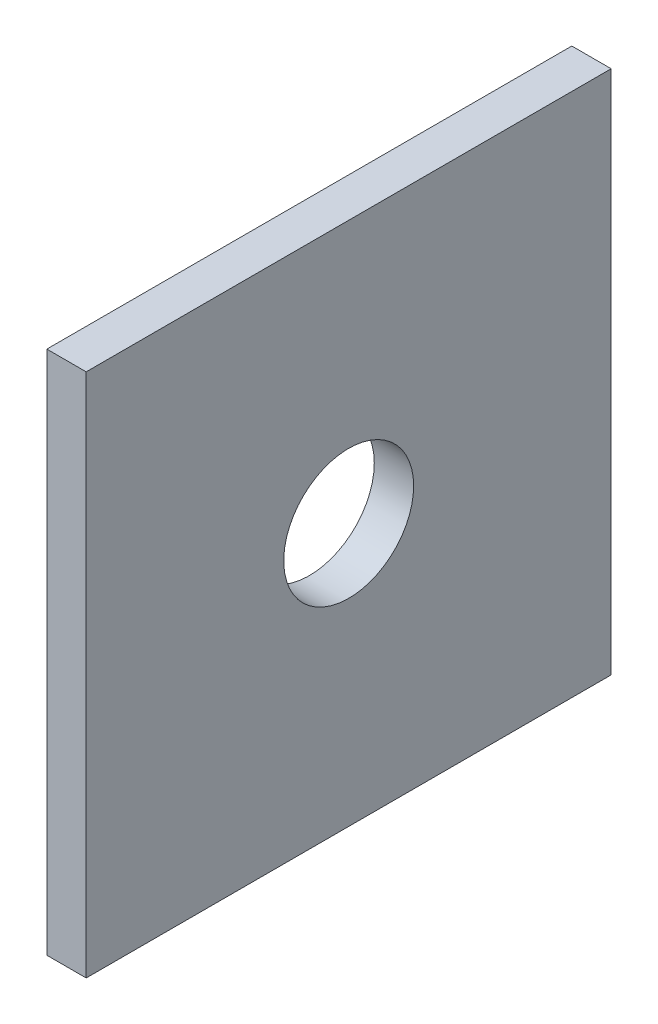
ISO-10303-21;
HEADER;
FILE_DESCRIPTION(('STEP AP214'),'2;1');
FILE_NAME('part.step','',(''),(''),'','','');
FILE_SCHEMA(('AUTOMOTIVE_DESIGN { 1 0 10303 214 1 1 1 1 }'));
ENDSEC;
DATA;
#1=APPLICATION_CONTEXT('core data for automotive mechanical design processes');
#2=APPLICATION_PROTOCOL_DEFINITION('international standard','automotive_design',2000,#1);
#3=PRODUCT_CONTEXT('',#1,'mechanical');
#4=PRODUCT('Part','Part','',(#3));
#5=PRODUCT_RELATED_PRODUCT_CATEGORY('part','',(#4));
#6=PRODUCT_DEFINITION_FORMATION('','',#4);
#7=PRODUCT_DEFINITION_CONTEXT('part definition',#1,'design');
#8=PRODUCT_DEFINITION('design','',#6,#7);
#9=PRODUCT_DEFINITION_SHAPE('','',#8);
#10=(LENGTH_UNIT() NAMED_UNIT(*) SI_UNIT(.MILLI.,.METRE.));
#11=(NAMED_UNIT(*) PLANE_ANGLE_UNIT() SI_UNIT($,.RADIAN.));
#12=(NAMED_UNIT(*) SI_UNIT($,.STERADIAN.) SOLID_ANGLE_UNIT());
#13=UNCERTAINTY_MEASURE_WITH_UNIT(LENGTH_MEASURE(1.E-05),#10,'distance_accuracy_value','');
#14=(GEOMETRIC_REPRESENTATION_CONTEXT(3) GLOBAL_UNCERTAINTY_ASSIGNED_CONTEXT((#13)) GLOBAL_UNIT_ASSIGNED_CONTEXT((#10,
#11,#12)) REPRESENTATION_CONTEXT('',''));
#15=CARTESIAN_POINT('',(0.,0.,0.));
#16=DIRECTION('',(0.,0.,1.));
#17=DIRECTION('',(1.,0.,0.));
#18=AXIS2_PLACEMENT_3D('',#15,#16,#17);
#19=CARTESIAN_POINT('',(3.,20.,-20.));
#20=DIRECTION('',(0.,0.,1.));
#21=DIRECTION('',(0.,-1.,0.));
#22=AXIS2_PLACEMENT_3D('',#19,#20,#21);
#23=PLANE('',#22);
#24=DIRECTION('',(0.,1.,0.));
#25=VECTOR('',#24,1.);
#26=CARTESIAN_POINT('',(0.,20.,-20.));
#27=LINE('',#26,#25);
#28=CARTESIAN_POINT('',(0.,-20.,-20.));
#29=VERTEX_POINT('',#28);
#30=CARTESIAN_POINT('',(0.,20.,-20.));
#31=VERTEX_POINT('',#30);
#32=EDGE_CURVE('E107',#29,#31,#27,.T.);
#33=ORIENTED_EDGE('',*,*,#32,.T.);
#34=DIRECTION('',(-1.,0.,0.));
#35=VECTOR('',#34,1.);
#36=CARTESIAN_POINT('',(3.,20.,-20.));
#37=LINE('',#36,#35);
#38=CARTESIAN_POINT('',(3.,20.,-20.));
#39=VERTEX_POINT('',#38);
#40=EDGE_CURVE('E11',#39,#31,#37,.T.);
#41=ORIENTED_EDGE('',*,*,#40,.F.);
#42=DIRECTION('',(0.,1.,0.));
#43=VECTOR('',#42,1.);
#44=CARTESIAN_POINT('',(3.,20.,-20.));
#45=LINE('',#44,#43);
#46=CARTESIAN_POINT('',(3.,-20.,-20.));
#47=VERTEX_POINT('',#46);
#48=EDGE_CURVE('E91',#47,#39,#45,.T.);
#49=ORIENTED_EDGE('',*,*,#48,.F.);
#50=DIRECTION('',(-1.,0.,0.));
#51=VECTOR('',#50,1.);
#52=CARTESIAN_POINT('',(3.,-20.,-20.));
#53=LINE('',#52,#51);
#54=EDGE_CURVE('E103',#47,#29,#53,.T.);
#55=ORIENTED_EDGE('',*,*,#54,.T.);
#56=EDGE_LOOP('',(#33,#41,#49,#55));
#57=FACE_BOUND('',#56,.T.);
#58=ADVANCED_FACE('F39',(#57),#23,.F.);
#59=CARTESIAN_POINT('',(3.,20.,20.));
#60=DIRECTION('',(0.,-1.,0.));
#61=DIRECTION('',(0.,0.,-1.));
#62=AXIS2_PLACEMENT_3D('',#59,#60,#61);
#63=PLANE('',#62);
#64=DIRECTION('',(0.,0.,1.));
#65=VECTOR('',#64,1.);
#66=CARTESIAN_POINT('',(0.,20.,20.));
#67=LINE('',#66,#65);
#68=CARTESIAN_POINT('',(0.,20.,20.));
#69=VERTEX_POINT('',#68);
#70=EDGE_CURVE('E96',#31,#69,#67,.T.);
#71=ORIENTED_EDGE('',*,*,#70,.T.);
#72=DIRECTION('',(-1.,0.,0.));
#73=VECTOR('',#72,1.);
#74=CARTESIAN_POINT('',(3.,20.,20.));
#75=LINE('',#74,#73);
#76=CARTESIAN_POINT('',(3.,20.,20.));
#77=VERTEX_POINT('',#76);
#78=EDGE_CURVE('E48',#77,#69,#75,.T.);
#79=ORIENTED_EDGE('',*,*,#78,.F.);
#80=DIRECTION('',(0.,0.,1.));
#81=VECTOR('',#80,1.);
#82=CARTESIAN_POINT('',(3.,20.,20.));
#83=LINE('',#82,#81);
#84=EDGE_CURVE('E86',#39,#77,#83,.T.);
#85=ORIENTED_EDGE('',*,*,#84,.F.);
#86=ORIENTED_EDGE('',*,*,#40,.T.);
#87=EDGE_LOOP('',(#71,#79,#85,#86));
#88=FACE_BOUND('',#87,.T.);
#89=ADVANCED_FACE('F95',(#88),#63,.F.);
#90=CARTESIAN_POINT('',(3.,20.,20.));
#91=DIRECTION('',(0.,0.,-1.));
#92=DIRECTION('',(0.,1.,0.));
#93=AXIS2_PLACEMENT_3D('',#90,#91,#92);
#94=PLANE('',#93);
#95=DIRECTION('',(0.,-1.,0.));
#96=VECTOR('',#95,1.);
#97=CARTESIAN_POINT('',(0.,20.,20.));
#98=LINE('',#97,#96);
#99=CARTESIAN_POINT('',(0.,-20.,20.));
#100=VERTEX_POINT('',#99);
#101=EDGE_CURVE('E73',#69,#100,#98,.T.);
#102=ORIENTED_EDGE('',*,*,#101,.T.);
#103=DIRECTION('',(-1.,0.,0.));
#104=VECTOR('',#103,1.);
#105=CARTESIAN_POINT('',(3.,-20.,20.));
#106=LINE('',#105,#104);
#107=CARTESIAN_POINT('',(3.,-20.,20.));
#108=VERTEX_POINT('',#107);
#109=EDGE_CURVE('E98',#108,#100,#106,.T.);
#110=ORIENTED_EDGE('',*,*,#109,.F.);
#111=DIRECTION('',(0.,-1.,0.));
#112=VECTOR('',#111,1.);
#113=CARTESIAN_POINT('',(3.,20.,20.));
#114=LINE('',#113,#112);
#115=EDGE_CURVE('E89',#77,#108,#114,.T.);
#116=ORIENTED_EDGE('',*,*,#115,.F.);
#117=ORIENTED_EDGE('',*,*,#78,.T.);
#118=EDGE_LOOP('',(#102,#110,#116,#117));
#119=FACE_BOUND('',#118,.T.);
#120=ADVANCED_FACE('F99',(#119),#94,.F.);
#121=CARTESIAN_POINT('',(3.,-20.,20.));
#122=DIRECTION('',(0.,1.,0.));
#123=DIRECTION('',(0.,0.,1.));
#124=AXIS2_PLACEMENT_3D('',#121,#122,#123);
#125=PLANE('',#124);
#126=DIRECTION('',(0.,0.,-1.));
#127=VECTOR('',#126,1.);
#128=CARTESIAN_POINT('',(0.,-20.,20.));
#129=LINE('',#128,#127);
#130=EDGE_CURVE('E79',#100,#29,#129,.T.);
#131=ORIENTED_EDGE('',*,*,#130,.T.);
#132=ORIENTED_EDGE('',*,*,#54,.F.);
#133=DIRECTION('',(0.,0.,-1.));
#134=VECTOR('',#133,1.);
#135=CARTESIAN_POINT('',(3.,-20.,20.));
#136=LINE('',#135,#134);
#137=EDGE_CURVE('E56',#108,#47,#136,.T.);
#138=ORIENTED_EDGE('',*,*,#137,.F.);
#139=ORIENTED_EDGE('',*,*,#109,.T.);
#140=EDGE_LOOP('',(#131,#132,#138,#139));
#141=FACE_BOUND('',#140,.T.);
#142=ADVANCED_FACE('F121',(#141),#125,.F.);
#143=CARTESIAN_POINT('',(3.,0.,0.));
#144=DIRECTION('',(1.,0.,0.));
#145=DIRECTION('',(0.,0.,-1.));
#146=AXIS2_PLACEMENT_3D('',#143,#144,#145);
#147=PLANE('',#146);
#148=CARTESIAN_POINT('',(3.,0.,0.));
#149=DIRECTION('',(1.,0.,0.));
#150=DIRECTION('',(0.,0.,-1.));
#151=AXIS2_PLACEMENT_3D('',#148,#149,#150);
#152=CIRCLE('',#151,4.95);
#153=CARTESIAN_POINT('',(3.,0.,-4.95));
#154=VERTEX_POINT('',#153);
#155=EDGE_CURVE('E128',#154,#154,#152,.T.);
#156=ORIENTED_EDGE('',*,*,#155,.F.);
#157=EDGE_LOOP('',(#156));
#158=FACE_BOUND('',#157,.T.);
#159=ORIENTED_EDGE('',*,*,#48,.T.);
#160=ORIENTED_EDGE('',*,*,#84,.T.);
#161=ORIENTED_EDGE('',*,*,#115,.T.);
#162=ORIENTED_EDGE('',*,*,#137,.T.);
#163=EDGE_LOOP('',(#159,#160,#161,#162));
#164=FACE_BOUND('',#163,.T.);
#165=ADVANCED_FACE('F87',(#158,#164),#147,.T.);
#166=CARTESIAN_POINT('',(0.,0.,0.));
#167=DIRECTION('',(1.,0.,0.));
#168=DIRECTION('',(0.,0.,-1.));
#169=AXIS2_PLACEMENT_3D('',#166,#167,#168);
#170=PLANE('',#169);
#171=CARTESIAN_POINT('',(0.,0.,0.));
#172=DIRECTION('',(1.,0.,0.));
#173=DIRECTION('',(0.,0.,-1.));
#174=AXIS2_PLACEMENT_3D('',#171,#172,#173);
#175=CIRCLE('',#174,4.95);
#176=CARTESIAN_POINT('',(0.,0.,-4.95));
#177=VERTEX_POINT('',#176);
#178=EDGE_CURVE('E111',#177,#177,#175,.T.);
#179=ORIENTED_EDGE('',*,*,#178,.T.);
#180=EDGE_LOOP('',(#179));
#181=FACE_BOUND('',#180,.T.);
#182=ORIENTED_EDGE('',*,*,#32,.F.);
#183=ORIENTED_EDGE('',*,*,#130,.F.);
#184=ORIENTED_EDGE('',*,*,#101,.F.);
#185=ORIENTED_EDGE('',*,*,#70,.F.);
#186=EDGE_LOOP('',(#182,#183,#184,#185));
#187=FACE_BOUND('',#186,.T.);
#188=ADVANCED_FACE('F124',(#181,#187),#170,.F.);
#189=CARTESIAN_POINT('',(0.,0.,0.));
#190=DIRECTION('',(1.,0.,0.));
#191=DIRECTION('',(0.,0.,-1.));
#192=AXIS2_PLACEMENT_3D('',#189,#190,#191);
#193=CYLINDRICAL_SURFACE('',#192,4.95);
#194=ORIENTED_EDGE('',*,*,#178,.F.);
#195=EDGE_LOOP('',(#194));
#196=FACE_BOUND('',#195,.T.);
#197=ORIENTED_EDGE('',*,*,#155,.T.);
#198=EDGE_LOOP('',(#197));
#199=FACE_BOUND('',#198,.T.);
#200=ADVANCED_FACE('F137',(#196,#199),#193,.F.);
#201=CLOSED_SHELL('',(#58,#89,#120,#142,#165,#188,#200));
#202=MANIFOLD_SOLID_BREP('B2',#201);
#203=ADVANCED_BREP_SHAPE_REPRESENTATION('',(#18,#202),#14);
#204=SHAPE_DEFINITION_REPRESENTATION(#9,#203);
ENDSEC;
END-ISO-10303-21;
